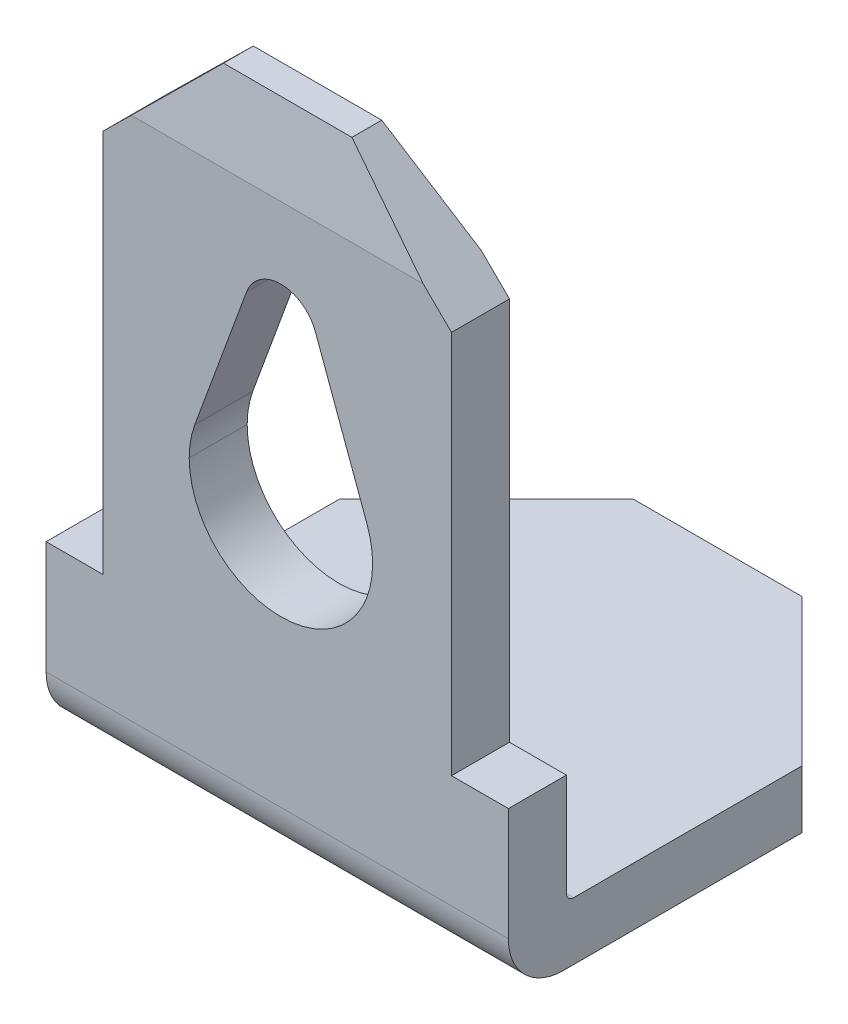
ISO-10303-21;
HEADER;
FILE_DESCRIPTION(('STEP AP214'),'2;1');
FILE_NAME('part.step','',(''),(''),'','','');
FILE_SCHEMA(('AUTOMOTIVE_DESIGN { 1 0 10303 214 1 1 1 1 }'));
ENDSEC;
DATA;
#1=APPLICATION_CONTEXT('core data for automotive mechanical design processes');
#2=APPLICATION_PROTOCOL_DEFINITION('international standard','automotive_design',2000,#1);
#3=PRODUCT_CONTEXT('',#1,'mechanical');
#4=PRODUCT('Part','Part','',(#3));
#5=PRODUCT_RELATED_PRODUCT_CATEGORY('part','',(#4));
#6=PRODUCT_DEFINITION_FORMATION('','',#4);
#7=PRODUCT_DEFINITION_CONTEXT('part definition',#1,'design');
#8=PRODUCT_DEFINITION('design','',#6,#7);
#9=PRODUCT_DEFINITION_SHAPE('','',#8);
#10=(LENGTH_UNIT() NAMED_UNIT(*) SI_UNIT(.MILLI.,.METRE.));
#11=(NAMED_UNIT(*) PLANE_ANGLE_UNIT() SI_UNIT($,.RADIAN.));
#12=(NAMED_UNIT(*) SI_UNIT($,.STERADIAN.) SOLID_ANGLE_UNIT());
#13=UNCERTAINTY_MEASURE_WITH_UNIT(LENGTH_MEASURE(1.E-05),#10,'distance_accuracy_value','');
#14=(GEOMETRIC_REPRESENTATION_CONTEXT(3) GLOBAL_UNCERTAINTY_ASSIGNED_CONTEXT((#13)) GLOBAL_UNIT_ASSIGNED_CONTEXT((#10,
#11,#12)) REPRESENTATION_CONTEXT('',''));
#15=CARTESIAN_POINT('',(0.,0.,0.));
#16=DIRECTION('',(0.,0.,1.));
#17=DIRECTION('',(1.,0.,0.));
#18=AXIS2_PLACEMENT_3D('',#15,#16,#17);
#19=CARTESIAN_POINT('',(0.755504439032288,6.71,-5.21));
#20=DIRECTION('',(0.702526659225822,-0.711657426770076,0.));
#21=DIRECTION('',(0.,0.,-1.));
#22=AXIS2_PLACEMENT_3D('',#19,#20,#21);
#23=PLANE('',#22);
#24=DIRECTION('',(0.,0.,1.));
#25=VECTOR('',#24,1.);
#26=CARTESIAN_POINT('',(2.275,8.21,-5.21));
#27=LINE('',#26,#25);
#28=CARTESIAN_POINT('',(2.275,8.21,0.241393442622949));
#29=VERTEX_POINT('',#28);
#30=CARTESIAN_POINT('',(2.275,8.21,0.647131147540979));
#31=VERTEX_POINT('',#30);
#32=EDGE_CURVE('E347',#29,#31,#27,.T.);
#33=ORIENTED_EDGE('',*,*,#32,.F.);
#34=DIRECTION('',(0.703347952461325,0.69432379783991,0.152368374414198));
#35=VECTOR('',#34,1.);
#36=CARTESIAN_POINT('',(3.70310483513415,9.61978184321707,0.550768072151586));
#37=LINE('',#36,#35);
#38=CARTESIAN_POINT('',(1.16070325529034,7.11,0.));
#39=VERTEX_POINT('',#38);
#40=EDGE_CURVE('E313',#39,#29,#37,.T.);
#41=ORIENTED_EDGE('',*,*,#40,.F.);
#42=DIRECTION('',(0.711657426770076,0.702526659225822,0.));
#43=VECTOR('',#42,1.);
#44=CARTESIAN_POINT('',(0.258824648699115,6.21969275288618,0.));
#45=LINE('',#44,#43);
#46=CARTESIAN_POINT('',(0.775,6.729245427366,0.));
#47=VERTEX_POINT('',#46);
#48=EDGE_CURVE('E289',#47,#39,#45,.T.);
#49=ORIENTED_EDGE('',*,*,#48,.F.);
#50=DIRECTION('',(0.,0.,-1.));
#51=VECTOR('',#50,1.);
#52=CARTESIAN_POINT('',(0.775,6.729245427366,7.54786240313508));
#53=LINE('',#52,#51);
#54=CARTESIAN_POINT('',(0.775,6.729245427366,0.79));
#55=VERTEX_POINT('',#54);
#56=EDGE_CURVE('E1116',#55,#47,#53,.T.);
#57=ORIENTED_EDGE('',*,*,#56,.F.);
#58=DIRECTION('',(0.711657426770076,0.702526659225822,0.));
#59=VECTOR('',#58,1.);
#60=CARTESIAN_POINT('',(0.755504439032288,6.71,0.79));
#61=LINE('',#60,#59);
#62=CARTESIAN_POINT('',(1.16070325529034,7.11,0.79));
#63=VERTEX_POINT('',#62);
#64=EDGE_CURVE('E407',#55,#63,#61,.T.);
#65=ORIENTED_EDGE('',*,*,#64,.T.);
#66=DIRECTION('',(-0.708713311399784,-0.699620317694541,0.0908672290418487));
#67=VECTOR('',#66,1.);
#68=CARTESIAN_POINT('',(4.29665509496487,10.2057166841054,0.387925918003297));
#69=LINE('',#68,#67);
#70=EDGE_CURVE('E370',#31,#63,#69,.T.);
#71=ORIENTED_EDGE('',*,*,#70,.F.);
#72=EDGE_LOOP('',(#33,#41,#49,#57,#65,#71));
#73=FACE_BOUND('',#72,.T.);
#74=ADVANCED_FACE('F16',(#73),#23,.F.);
#75=CARTESIAN_POINT('',(5.54449556096771,6.71,-5.21));
#76=DIRECTION('',(-0.702526659225822,-0.711657426770076,0.));
#77=DIRECTION('',(-0.711657426770076,0.702526659225822,0.));
#78=AXIS2_PLACEMENT_3D('',#75,#76,#77);
#79=PLANE('',#78);
#80=DIRECTION('',(0.711657426770076,-0.702526659225822,0.));
#81=VECTOR('',#80,1.);
#82=CARTESIAN_POINT('',(5.54449556096771,6.71,0.79));
#83=LINE('',#82,#81);
#84=CARTESIAN_POINT('',(5.13929674470966,7.11,0.79));
#85=VERTEX_POINT('',#84);
#86=CARTESIAN_POINT('',(5.525,6.729245427366,0.79));
#87=VERTEX_POINT('',#86);
#88=EDGE_CURVE('E403',#85,#87,#83,.T.);
#89=ORIENTED_EDGE('',*,*,#88,.T.);
#90=DIRECTION('',(0.,0.,1.));
#91=VECTOR('',#90,1.);
#92=CARTESIAN_POINT('',(5.525,6.729245427366,7.54786240313508));
#93=LINE('',#92,#91);
#94=CARTESIAN_POINT('',(5.525,6.729245427366,0.));
#95=VERTEX_POINT('',#94);
#96=EDGE_CURVE('E27',#95,#87,#93,.T.);
#97=ORIENTED_EDGE('',*,*,#96,.F.);
#98=DIRECTION('',(0.711657426770076,-0.702526659225822,0.));
#99=VECTOR('',#98,1.);
#100=CARTESIAN_POINT('',(9.23184999768602,3.06995537127141,0.));
#101=LINE('',#100,#99);
#102=CARTESIAN_POINT('',(5.13929674470966,7.11,0.));
#103=VERTEX_POINT('',#102);
#104=EDGE_CURVE('E302',#103,#95,#101,.T.);
#105=ORIENTED_EDGE('',*,*,#104,.F.);
#106=DIRECTION('',(0.703347952461325,-0.69432379783991,-0.152368374414198));
#107=VECTOR('',#106,1.);
#108=CARTESIAN_POINT('',(5.71349472092454,6.54316914741508,-0.124390228082159));
#109=LINE('',#108,#107);
#110=CARTESIAN_POINT('',(4.025,8.21,0.241393442622949));
#111=VERTEX_POINT('',#110);
#112=EDGE_CURVE('E328',#111,#103,#109,.T.);
#113=ORIENTED_EDGE('',*,*,#112,.F.);
#114=DIRECTION('',(0.,0.,1.));
#115=VECTOR('',#114,1.);
#116=CARTESIAN_POINT('',(4.025,8.21,-5.21));
#117=LINE('',#116,#115);
#118=CARTESIAN_POINT('',(4.025,8.21,0.647131147540979));
#119=VERTEX_POINT('',#118);
#120=EDGE_CURVE('E312',#111,#119,#117,.T.);
#121=ORIENTED_EDGE('',*,*,#120,.T.);
#122=DIRECTION('',(-0.708713311399784,0.699620317694541,-0.0908672290418487));
#123=VECTOR('',#122,1.);
#124=CARTESIAN_POINT('',(5.16767461889319,7.0819862220274,0.793638451192715));
#125=LINE('',#124,#123);
#126=EDGE_CURVE('E367',#85,#119,#125,.T.);
#127=ORIENTED_EDGE('',*,*,#126,.F.);
#128=EDGE_LOOP('',(#89,#97,#105,#113,#121,#127));
#129=FACE_BOUND('',#128,.T.);
#130=ADVANCED_FACE('F691',(#129),#79,.F.);
#131=CARTESIAN_POINT('',(6.3,1.49672365683442,7.54786240313508));
#132=DIRECTION('',(0.,-1.,0.));
#133=DIRECTION('',(0.,0.,-1.));
#134=AXIS2_PLACEMENT_3D('',#131,#132,#133);
#135=PLANE('',#134);
#136=DIRECTION('',(1.,0.,0.));
#137=VECTOR('',#136,1.);
#138=CARTESIAN_POINT('',(6.3,1.49672365683442,0.79));
#139=LINE('',#138,#137);
#140=CARTESIAN_POINT('',(5.525,1.49672365683442,0.79));
#141=VERTEX_POINT('',#140);
#142=CARTESIAN_POINT('',(6.3,1.49672365683442,0.79));
#143=VERTEX_POINT('',#142);
#144=EDGE_CURVE('E272',#141,#143,#139,.T.);
#145=ORIENTED_EDGE('',*,*,#144,.T.);
#146=DIRECTION('',(0.,0.,-1.));
#147=VECTOR('',#146,1.);
#148=CARTESIAN_POINT('',(6.3,1.49672365683442,7.54786240313508));
#149=LINE('',#148,#147);
#150=CARTESIAN_POINT('',(6.3,1.49672365683442,0.));
#151=VERTEX_POINT('',#150);
#152=EDGE_CURVE('E288',#143,#151,#149,.T.);
#153=ORIENTED_EDGE('',*,*,#152,.T.);
#154=DIRECTION('',(-1.,0.,0.));
#155=VECTOR('',#154,1.);
#156=CARTESIAN_POINT('',(6.3,1.49672365683442,0.));
#157=LINE('',#156,#155);
#158=CARTESIAN_POINT('',(5.525,1.49672365683442,0.));
#159=VERTEX_POINT('',#158);
#160=EDGE_CURVE('E458',#151,#159,#157,.T.);
#161=ORIENTED_EDGE('',*,*,#160,.T.);
#162=DIRECTION('',(0.,0.,-1.));
#163=VECTOR('',#162,1.);
#164=CARTESIAN_POINT('',(5.525,1.49672365683442,7.54786240313508));
#165=LINE('',#164,#163);
#166=EDGE_CURVE('E11',#141,#159,#165,.T.);
#167=ORIENTED_EDGE('',*,*,#166,.F.);
#168=EDGE_LOOP('',(#145,#153,#161,#167));
#169=FACE_BOUND('',#168,.T.);
#170=ADVANCED_FACE('F767',(#169),#135,.F.);
#171=CARTESIAN_POINT('',(5.525,1.49672365683442,7.54786240313508));
#172=DIRECTION('',(-1.,0.,0.));
#173=DIRECTION('',(0.,0.,1.));
#174=AXIS2_PLACEMENT_3D('',#171,#172,#173);
#175=PLANE('',#174);
#176=DIRECTION('',(0.,1.,0.));
#177=VECTOR('',#176,1.);
#178=CARTESIAN_POINT('',(5.525,1.49672365683442,0.));
#179=LINE('',#178,#177);
#180=EDGE_CURVE('E444',#159,#95,#179,.T.);
#181=ORIENTED_EDGE('',*,*,#180,.T.);
#182=ORIENTED_EDGE('',*,*,#96,.T.);
#183=DIRECTION('',(0.,-1.,0.));
#184=VECTOR('',#183,1.);
#185=CARTESIAN_POINT('',(5.525,1.49672365683442,0.79));
#186=LINE('',#185,#184);
#187=EDGE_CURVE('E408',#87,#141,#186,.T.);
#188=ORIENTED_EDGE('',*,*,#187,.T.);
#189=ORIENTED_EDGE('',*,*,#166,.T.);
#190=EDGE_LOOP('',(#181,#182,#188,#189));
#191=FACE_BOUND('',#190,.T.);
#192=ADVANCED_FACE('F794',(#191),#175,.F.);
#193=CARTESIAN_POINT('',(0.,1.49672365683442,7.54786240313508));
#194=DIRECTION('',(0.,-1.,0.));
#195=DIRECTION('',(0.,0.,-1.));
#196=AXIS2_PLACEMENT_3D('',#193,#194,#195);
#197=PLANE('',#196);
#198=DIRECTION('',(1.,0.,0.));
#199=VECTOR('',#198,1.);
#200=CARTESIAN_POINT('',(0.,1.49672365683442,0.79));
#201=LINE('',#200,#199);
#202=CARTESIAN_POINT('',(0.,1.49672365683442,0.79));
#203=VERTEX_POINT('',#202);
#204=CARTESIAN_POINT('',(0.775,1.49672365683442,0.79));
#205=VERTEX_POINT('',#204);
#206=EDGE_CURVE('E303',#203,#205,#201,.T.);
#207=ORIENTED_EDGE('',*,*,#206,.T.);
#208=DIRECTION('',(0.,0.,-1.));
#209=VECTOR('',#208,1.);
#210=CARTESIAN_POINT('',(0.775,1.49672365683442,7.54786240313508));
#211=LINE('',#210,#209);
#212=CARTESIAN_POINT('',(0.775,1.49672365683442,0.));
#213=VERTEX_POINT('',#212);
#214=EDGE_CURVE('E119',#205,#213,#211,.T.);
#215=ORIENTED_EDGE('',*,*,#214,.T.);
#216=DIRECTION('',(-1.,0.,0.));
#217=VECTOR('',#216,1.);
#218=CARTESIAN_POINT('',(0.,1.49672365683442,0.));
#219=LINE('',#218,#217);
#220=CARTESIAN_POINT('',(0.,1.49672365683442,0.));
#221=VERTEX_POINT('',#220);
#222=EDGE_CURVE('E371',#213,#221,#219,.T.);
#223=ORIENTED_EDGE('',*,*,#222,.T.);
#224=DIRECTION('',(0.,0.,-1.));
#225=VECTOR('',#224,1.);
#226=CARTESIAN_POINT('',(0.,1.49672365683442,7.54786240313508));
#227=LINE('',#226,#225);
#228=EDGE_CURVE('E101',#203,#221,#227,.T.);
#229=ORIENTED_EDGE('',*,*,#228,.F.);
#230=EDGE_LOOP('',(#207,#215,#223,#229));
#231=FACE_BOUND('',#230,.T.);
#232=ADVANCED_FACE('F803',(#231),#197,.F.);
#233=CARTESIAN_POINT('',(0.775,1.49672365683442,7.54786240313508));
#234=DIRECTION('',(1.,0.,0.));
#235=DIRECTION('',(0.,1.,0.));
#236=AXIS2_PLACEMENT_3D('',#233,#234,#235);
#237=PLANE('',#236);
#238=DIRECTION('',(0.,1.,0.));
#239=VECTOR('',#238,1.);
#240=CARTESIAN_POINT('',(0.775,1.49672365683442,0.79));
#241=LINE('',#240,#239);
#242=EDGE_CURVE('E307',#205,#55,#241,.T.);
#243=ORIENTED_EDGE('',*,*,#242,.T.);
#244=ORIENTED_EDGE('',*,*,#56,.T.);
#245=DIRECTION('',(0.,-1.,0.));
#246=VECTOR('',#245,1.);
#247=CARTESIAN_POINT('',(0.775,1.49672365683442,0.));
#248=LINE('',#247,#246);
#249=EDGE_CURVE('E292',#47,#213,#248,.T.);
#250=ORIENTED_EDGE('',*,*,#249,.T.);
#251=ORIENTED_EDGE('',*,*,#214,.F.);
#252=EDGE_LOOP('',(#243,#244,#250,#251));
#253=FACE_BOUND('',#252,.T.);
#254=ADVANCED_FACE('F684',(#253),#237,.F.);
#255=CARTESIAN_POINT('',(2.73062224435422,5.80882986931079,-4.65485766531386));
#256=DIRECTION('',(-0.938755511291561,0.344583937553277,0.));
#257=DIRECTION('',(0.,0.,1.));
#258=AXIS2_PLACEMENT_3D('',#255,#256,#257);
#259=PLANE('',#258);
#260=DIRECTION('',(0.344583937553277,0.938755511291561,0.));
#261=VECTOR('',#260,1.);
#262=CARTESIAN_POINT('',(2.73062224435422,5.80882986931079,0.));
#263=LINE('',#262,#261);
#264=CARTESIAN_POINT('',(2.02655561088555,3.89072992194159,0.));
#265=VERTEX_POINT('',#264);
#266=CARTESIAN_POINT('',(2.73062224435422,5.80882986931079,0.));
#267=VERTEX_POINT('',#266);
#268=EDGE_CURVE('E254',#265,#267,#263,.T.);
#269=ORIENTED_EDGE('',*,*,#268,.T.);
#270=DIRECTION('',(0.,0.,1.));
#271=VECTOR('',#270,1.);
#272=CARTESIAN_POINT('',(2.73062224435422,5.80882986931079,-4.65485766531386));
#273=LINE('',#272,#271);
#274=CARTESIAN_POINT('',(2.73062224435422,5.80882986931079,0.79));
#275=VERTEX_POINT('',#274);
#276=EDGE_CURVE('E249',#267,#275,#273,.T.);
#277=ORIENTED_EDGE('',*,*,#276,.T.);
#278=DIRECTION('',(-0.344583937553277,-0.938755511291561,0.));
#279=VECTOR('',#278,1.);
#280=CARTESIAN_POINT('',(2.73062224435422,5.80882986931079,0.79));
#281=LINE('',#280,#279);
#282=CARTESIAN_POINT('',(2.02655561088555,3.89072992194159,0.79));
#283=VERTEX_POINT('',#282);
#284=EDGE_CURVE('E252',#275,#283,#281,.T.);
#285=ORIENTED_EDGE('',*,*,#284,.T.);
#286=DIRECTION('',(0.,0.,1.));
#287=VECTOR('',#286,1.);
#288=CARTESIAN_POINT('',(2.02655561088555,3.89072992194159,-4.65485766531386));
#289=LINE('',#288,#287);
#290=EDGE_CURVE('E42',#265,#283,#289,.T.);
#291=ORIENTED_EDGE('',*,*,#290,.F.);
#292=EDGE_LOOP('',(#269,#277,#285,#291));
#293=FACE_BOUND('',#292,.T.);
#294=ADVANCED_FACE('F18',(#293),#259,.F.);
#295=CARTESIAN_POINT('',(3.2,3.46,-4.65485766531386));
#296=DIRECTION('',(0.,0.,1.));
#297=DIRECTION('',(1.,0.,0.));
#298=AXIS2_PLACEMENT_3D('',#295,#296,#297);
#299=CYLINDRICAL_SURFACE('',#298,1.25);
#300=DIRECTION('',(0.,0.,1.));
#301=VECTOR('',#300,1.);
#302=CARTESIAN_POINT('',(1.95,3.46,-4.65485766531386));
#303=LINE('',#302,#301);
#304=CARTESIAN_POINT('',(1.95,3.46,0.));
#305=VERTEX_POINT('',#304);
#306=CARTESIAN_POINT('',(1.95,3.46,0.79));
#307=VERTEX_POINT('',#306);
#308=EDGE_CURVE('E338',#305,#307,#303,.T.);
#309=ORIENTED_EDGE('',*,*,#308,.F.);
#310=CARTESIAN_POINT('',(3.2,3.46,0.));
#311=DIRECTION('',(0.,0.,-1.));
#312=DIRECTION('',(0.,-1.,0.));
#313=AXIS2_PLACEMENT_3D('',#310,#311,#312);
#314=CIRCLE('',#313,1.25);
#315=EDGE_CURVE('E402',#305,#265,#314,.T.);
#316=ORIENTED_EDGE('',*,*,#315,.T.);
#317=ORIENTED_EDGE('',*,*,#290,.T.);
#318=CARTESIAN_POINT('',(3.2,3.46,0.79));
#319=DIRECTION('',(0.,0.,1.));
#320=DIRECTION('',(1.,0.,0.));
#321=AXIS2_PLACEMENT_3D('',#318,#319,#320);
#322=CIRCLE('',#321,1.25);
#323=EDGE_CURVE('E270',#283,#307,#322,.T.);
#324=ORIENTED_EDGE('',*,*,#323,.T.);
#325=EDGE_LOOP('',(#309,#316,#317,#324));
#326=FACE_BOUND('',#325,.T.);
#327=ADVANCED_FACE('F683',(#326),#299,.F.);
#328=CARTESIAN_POINT('',(3.66963395220552,5.8081302981974,-4.65485766531386));
#329=DIRECTION('',(0.938755417652649,0.344584192655147,0.));
#330=DIRECTION('',(0.,0.,-1.));
#331=AXIS2_PLACEMENT_3D('',#328,#329,#330);
#332=PLANE('',#331);
#333=DIRECTION('',(0.344584192655148,-0.93875541765265,0.));
#334=VECTOR('',#333,1.);
#335=CARTESIAN_POINT('',(3.66963395220552,5.8081302981974,0.));
#336=LINE('',#335,#334);
#337=CARTESIAN_POINT('',(3.66963395220552,5.8081302981974,0.));
#338=VERTEX_POINT('',#337);
#339=CARTESIAN_POINT('',(4.37344427206581,3.89073024081894,0.));
#340=VERTEX_POINT('',#339);
#341=EDGE_CURVE('E157',#338,#340,#336,.T.);
#342=ORIENTED_EDGE('',*,*,#341,.T.);
#343=DIRECTION('',(0.,0.,1.));
#344=VECTOR('',#343,1.);
#345=CARTESIAN_POINT('',(4.37344427206581,3.89073024081894,-4.65485766531386));
#346=LINE('',#345,#344);
#347=CARTESIAN_POINT('',(4.37344427206581,3.89073024081894,0.79));
#348=VERTEX_POINT('',#347);
#349=EDGE_CURVE('E333',#340,#348,#346,.T.);
#350=ORIENTED_EDGE('',*,*,#349,.T.);
#351=DIRECTION('',(-0.344584192655148,0.93875541765265,0.));
#352=VECTOR('',#351,1.);
#353=CARTESIAN_POINT('',(3.66963395220552,5.8081302981974,0.79));
#354=LINE('',#353,#352);
#355=CARTESIAN_POINT('',(3.66963395220552,5.8081302981974,0.79));
#356=VERTEX_POINT('',#355);
#357=EDGE_CURVE('E265',#348,#356,#354,.T.);
#358=ORIENTED_EDGE('',*,*,#357,.T.);
#359=DIRECTION('',(0.,0.,1.));
#360=VECTOR('',#359,1.);
#361=CARTESIAN_POINT('',(3.66963395220552,5.8081302981974,-4.65485766531386));
#362=LINE('',#361,#360);
#363=EDGE_CURVE('E20',#338,#356,#362,.T.);
#364=ORIENTED_EDGE('',*,*,#363,.F.);
#365=EDGE_LOOP('',(#342,#350,#358,#364));
#366=FACE_BOUND('',#365,.T.);
#367=ADVANCED_FACE('F735',(#366),#332,.F.);
#368=CARTESIAN_POINT('',(3.2,5.63653790053415,-4.65485766531386));
#369=DIRECTION('',(0.,0.,1.));
#370=DIRECTION('',(1.,0.,0.));
#371=AXIS2_PLACEMENT_3D('',#368,#369,#370);
#372=CYLINDRICAL_SURFACE('',#371,0.5);
#373=CARTESIAN_POINT('',(3.2,5.63653790053415,0.));
#374=DIRECTION('',(0.,0.,-1.));
#375=DIRECTION('',(0.,-1.,0.));
#376=AXIS2_PLACEMENT_3D('',#373,#374,#375);
#377=CIRCLE('',#376,0.5);
#378=EDGE_CURVE('E354',#267,#338,#377,.T.);
#379=ORIENTED_EDGE('',*,*,#378,.T.);
#380=ORIENTED_EDGE('',*,*,#363,.T.);
#381=CARTESIAN_POINT('',(3.2,5.63653790053415,0.79));
#382=DIRECTION('',(0.,0.,1.));
#383=DIRECTION('',(1.,0.,0.));
#384=AXIS2_PLACEMENT_3D('',#381,#382,#383);
#385=CIRCLE('',#384,0.5);
#386=EDGE_CURVE('E261',#356,#275,#385,.T.);
#387=ORIENTED_EDGE('',*,*,#386,.T.);
#388=ORIENTED_EDGE('',*,*,#276,.F.);
#389=EDGE_LOOP('',(#379,#380,#387,#388));
#390=FACE_BOUND('',#389,.T.);
#391=ADVANCED_FACE('F262',(#390),#372,.F.);
#392=CARTESIAN_POINT('',(2.,-0.79,-5.21));
#393=DIRECTION('',(0.707106781186549,0.,0.707106781186546));
#394=DIRECTION('',(0.,-1.,0.));
#395=AXIS2_PLACEMENT_3D('',#392,#393,#394);
#396=PLANE('',#395);
#397=DIRECTION('',(0.707106781186546,0.,-0.707106781186549));
#398=VECTOR('',#397,1.);
#399=CARTESIAN_POINT('',(2.,-0.79,-5.21));
#400=LINE('',#399,#398);
#401=CARTESIAN_POINT('',(0.,-0.79,-3.21));
#402=VERTEX_POINT('',#401);
#403=CARTESIAN_POINT('',(2.,-0.79,-5.21));
#404=VERTEX_POINT('',#403);
#405=EDGE_CURVE('E388',#402,#404,#400,.T.);
#406=ORIENTED_EDGE('',*,*,#405,.F.);
#407=DIRECTION('',(0.,-1.,0.));
#408=VECTOR('',#407,1.);
#409=CARTESIAN_POINT('',(0.,-0.0400000000000007,-3.21));
#410=LINE('',#409,#408);
#411=CARTESIAN_POINT('',(0.,0.,-3.21));
#412=VERTEX_POINT('',#411);
#413=EDGE_CURVE('E497',#412,#402,#410,.T.);
#414=ORIENTED_EDGE('',*,*,#413,.F.);
#415=DIRECTION('',(-0.707106781186546,0.,0.707106781186549));
#416=VECTOR('',#415,1.);
#417=CARTESIAN_POINT('',(2.,0.,-5.21));
#418=LINE('',#417,#416);
#419=CARTESIAN_POINT('',(2.,0.,-5.21));
#420=VERTEX_POINT('',#419);
#421=EDGE_CURVE('E357',#420,#412,#418,.T.);
#422=ORIENTED_EDGE('',*,*,#421,.F.);
#423=DIRECTION('',(0.,1.,0.));
#424=VECTOR('',#423,1.);
#425=CARTESIAN_POINT('',(2.,-0.79,-5.21));
#426=LINE('',#425,#424);
#427=EDGE_CURVE('E314',#404,#420,#426,.T.);
#428=ORIENTED_EDGE('',*,*,#427,.F.);
#429=EDGE_LOOP('',(#406,#414,#422,#428));
#430=FACE_BOUND('',#429,.T.);
#431=ADVANCED_FACE('F487',(#430),#396,.F.);
#432=CARTESIAN_POINT('',(6.3,-0.0400000000000007,-3.21));
#433=DIRECTION('',(0.707106781186546,0.,-0.707106781186549));
#434=DIRECTION('',(0.,-1.,0.));
#435=AXIS2_PLACEMENT_3D('',#432,#433,#434);
#436=PLANE('',#435);
#437=DIRECTION('',(0.707106781186549,0.,0.707106781186546));
#438=VECTOR('',#437,1.);
#439=CARTESIAN_POINT('',(6.3,-0.79,-3.21));
#440=LINE('',#439,#438);
#441=CARTESIAN_POINT('',(4.3,-0.79,-5.21));
#442=VERTEX_POINT('',#441);
#443=CARTESIAN_POINT('',(6.3,-0.79,-3.21));
#444=VERTEX_POINT('',#443);
#445=EDGE_CURVE('E378',#442,#444,#440,.T.);
#446=ORIENTED_EDGE('',*,*,#445,.F.);
#447=DIRECTION('',(0.,-1.,0.));
#448=VECTOR('',#447,1.);
#449=CARTESIAN_POINT('',(4.3,-0.79,-5.21));
#450=LINE('',#449,#448);
#451=CARTESIAN_POINT('',(4.3,0.,-5.21));
#452=VERTEX_POINT('',#451);
#453=EDGE_CURVE('E319',#452,#442,#450,.T.);
#454=ORIENTED_EDGE('',*,*,#453,.F.);
#455=DIRECTION('',(-0.707106781186549,0.,-0.707106781186546));
#456=VECTOR('',#455,1.);
#457=CARTESIAN_POINT('',(6.3,0.,-3.21));
#458=LINE('',#457,#456);
#459=CARTESIAN_POINT('',(6.3,0.,-3.21));
#460=VERTEX_POINT('',#459);
#461=EDGE_CURVE('E361',#460,#452,#458,.T.);
#462=ORIENTED_EDGE('',*,*,#461,.F.);
#463=DIRECTION('',(0.,1.,0.));
#464=VECTOR('',#463,1.);
#465=CARTESIAN_POINT('',(6.3,0.,-3.21));
#466=LINE('',#465,#464);
#467=EDGE_CURVE('E285',#444,#460,#466,.T.);
#468=ORIENTED_EDGE('',*,*,#467,.F.);
#469=EDGE_LOOP('',(#446,#454,#462,#468));
#470=FACE_BOUND('',#469,.T.);
#471=ADVANCED_FACE('F699',(#470),#436,.T.);
#472=CARTESIAN_POINT('',(0.,-0.0400000000000007,0.0399999999999991));
#473=DIRECTION('',(1.,0.,0.));
#474=DIRECTION('',(0.,1.,0.));
#475=AXIS2_PLACEMENT_3D('',#472,#473,#474);
#476=PLANE('',#475);
#477=DIRECTION('',(0.,-1.,0.));
#478=VECTOR('',#477,1.);
#479=CARTESIAN_POINT('',(0.,7.11,0.79));
#480=LINE('',#479,#478);
#481=CARTESIAN_POINT('',(0.,-0.0400000000000005,0.79));
#482=VERTEX_POINT('',#481);
#483=EDGE_CURVE('E306',#203,#482,#480,.T.);
#484=ORIENTED_EDGE('',*,*,#483,.F.);
#485=ORIENTED_EDGE('',*,*,#228,.T.);
#486=DIRECTION('',(0.,1.,0.));
#487=VECTOR('',#486,1.);
#488=CARTESIAN_POINT('',(0.,0.1,0.));
#489=LINE('',#488,#487);
#490=CARTESIAN_POINT('',(0.,0.1,0.));
#491=VERTEX_POINT('',#490);
#492=EDGE_CURVE('E374',#491,#221,#489,.T.);
#493=ORIENTED_EDGE('',*,*,#492,.F.);
#494=CARTESIAN_POINT('',(0.,0.1,-0.1));
#495=DIRECTION('',(-1.,0.,0.));
#496=DIRECTION('',(0.,0.,-1.));
#497=AXIS2_PLACEMENT_3D('',#494,#495,#496);
#498=CIRCLE('',#497,0.1);
#499=CARTESIAN_POINT('',(0.,0.,-0.1));
#500=VERTEX_POINT('',#499);
#501=EDGE_CURVE('E298',#500,#491,#498,.T.);
#502=ORIENTED_EDGE('',*,*,#501,.F.);
#503=DIRECTION('',(0.,0.,1.));
#504=VECTOR('',#503,1.);
#505=CARTESIAN_POINT('',(0.,0.,-5.21));
#506=LINE('',#505,#504);
#507=EDGE_CURVE('E283',#412,#500,#506,.T.);
#508=ORIENTED_EDGE('',*,*,#507,.F.);
#509=ORIENTED_EDGE('',*,*,#413,.T.);
#510=DIRECTION('',(0.,0.,-1.));
#511=VECTOR('',#510,1.);
#512=CARTESIAN_POINT('',(0.,-0.79,0.0399999999999991));
#513=LINE('',#512,#511);
#514=CARTESIAN_POINT('',(0.,-0.79,0.0399999999999991));
#515=VERTEX_POINT('',#514);
#516=EDGE_CURVE('E384',#515,#402,#513,.T.);
#517=ORIENTED_EDGE('',*,*,#516,.F.);
#518=CARTESIAN_POINT('',(0.,-0.0400000000000007,0.0399999999999991));
#519=DIRECTION('',(1.,0.,0.));
#520=DIRECTION('',(0.,0.,-1.));
#521=AXIS2_PLACEMENT_3D('',#518,#519,#520);
#522=CIRCLE('',#521,0.75);
#523=EDGE_CURVE('E432',#482,#515,#522,.T.);
#524=ORIENTED_EDGE('',*,*,#523,.F.);
#525=EDGE_LOOP('',(#484,#485,#493,#502,#508,#509,#517,#524));
#526=FACE_BOUND('',#525,.T.);
#527=ADVANCED_FACE('F495',(#526),#476,.F.);
#528=CARTESIAN_POINT('',(6.3,-0.0400000000000007,0.0399999999999991));
#529=DIRECTION('',(1.,0.,0.));
#530=DIRECTION('',(0.,1.,0.));
#531=AXIS2_PLACEMENT_3D('',#528,#529,#530);
#532=PLANE('',#531);
#533=ORIENTED_EDGE('',*,*,#152,.F.);
#534=DIRECTION('',(0.,-1.,0.));
#535=VECTOR('',#534,1.);
#536=CARTESIAN_POINT('',(6.3,7.11,0.79));
#537=LINE('',#536,#535);
#538=CARTESIAN_POINT('',(6.3,-0.0400000000000005,0.79));
#539=VERTEX_POINT('',#538);
#540=EDGE_CURVE('E279',#143,#539,#537,.T.);
#541=ORIENTED_EDGE('',*,*,#540,.T.);
#542=CARTESIAN_POINT('',(6.3,-0.0400000000000007,0.0399999999999991));
#543=DIRECTION('',(1.,0.,0.));
#544=DIRECTION('',(0.,0.,-1.));
#545=AXIS2_PLACEMENT_3D('',#542,#543,#544);
#546=CIRCLE('',#545,0.75);
#547=CARTESIAN_POINT('',(6.3,-0.79,0.0399999999999991));
#548=VERTEX_POINT('',#547);
#549=EDGE_CURVE('E416',#539,#548,#546,.T.);
#550=ORIENTED_EDGE('',*,*,#549,.T.);
#551=DIRECTION('',(0.,0.,-1.));
#552=VECTOR('',#551,1.);
#553=CARTESIAN_POINT('',(6.3,-0.79,0.0399999999999991));
#554=LINE('',#553,#552);
#555=EDGE_CURVE('E382',#548,#444,#554,.T.);
#556=ORIENTED_EDGE('',*,*,#555,.T.);
#557=ORIENTED_EDGE('',*,*,#467,.T.);
#558=DIRECTION('',(0.,0.,1.));
#559=VECTOR('',#558,1.);
#560=CARTESIAN_POINT('',(6.3,0.,-5.21));
#561=LINE('',#560,#559);
#562=CARTESIAN_POINT('',(6.3,0.,-0.1));
#563=VERTEX_POINT('',#562);
#564=EDGE_CURVE('E318',#460,#563,#561,.T.);
#565=ORIENTED_EDGE('',*,*,#564,.T.);
#566=CARTESIAN_POINT('',(6.3,0.1,-0.1));
#567=DIRECTION('',(-1.,0.,0.));
#568=DIRECTION('',(0.,0.,-1.));
#569=AXIS2_PLACEMENT_3D('',#566,#567,#568);
#570=CIRCLE('',#569,0.1);
#571=CARTESIAN_POINT('',(6.3,0.1,0.));
#572=VERTEX_POINT('',#571);
#573=EDGE_CURVE('E297',#563,#572,#570,.T.);
#574=ORIENTED_EDGE('',*,*,#573,.T.);
#575=DIRECTION('',(0.,1.,0.));
#576=VECTOR('',#575,1.);
#577=CARTESIAN_POINT('',(6.3,0.1,0.));
#578=LINE('',#577,#576);
#579=EDGE_CURVE('E1119',#572,#151,#578,.T.);
#580=ORIENTED_EDGE('',*,*,#579,.T.);
#581=EDGE_LOOP('',(#533,#541,#550,#556,#557,#565,#574,#580));
#582=FACE_BOUND('',#581,.T.);
#583=ADVANCED_FACE('F811',(#582),#532,.T.);
#584=CARTESIAN_POINT('',(6.3,0.1,0.));
#585=DIRECTION('',(0.,0.,1.));
#586=DIRECTION('',(0.,-1.,0.));
#587=AXIS2_PLACEMENT_3D('',#584,#585,#586);
#588=PLANE('',#587);
#589=ORIENTED_EDGE('',*,*,#341,.F.);
#590=ORIENTED_EDGE('',*,*,#378,.F.);
#591=ORIENTED_EDGE('',*,*,#268,.F.);
#592=ORIENTED_EDGE('',*,*,#315,.F.);
#593=CARTESIAN_POINT('',(3.2,3.46,0.));
#594=DIRECTION('',(0.,0.,-1.));
#595=DIRECTION('',(0.,-1.,0.));
#596=AXIS2_PLACEMENT_3D('',#593,#594,#595);
#597=CIRCLE('',#596,1.25);
#598=CARTESIAN_POINT('',(4.45,3.46,0.));
#599=VERTEX_POINT('',#598);
#600=EDGE_CURVE('E334',#599,#305,#597,.T.);
#601=ORIENTED_EDGE('',*,*,#600,.F.);
#602=CARTESIAN_POINT('',(3.2,3.46,0.));
#603=DIRECTION('',(0.,0.,-1.));
#604=DIRECTION('',(0.,-1.,0.));
#605=AXIS2_PLACEMENT_3D('',#602,#603,#604);
#606=CIRCLE('',#605,1.25);
#607=EDGE_CURVE('E345',#340,#599,#606,.T.);
#608=ORIENTED_EDGE('',*,*,#607,.F.);
#609=EDGE_LOOP('',(#589,#590,#591,#592,#601,#608));
#610=FACE_BOUND('',#609,.T.);
#611=DIRECTION('',(-1.,0.,0.));
#612=VECTOR('',#611,1.);
#613=CARTESIAN_POINT('',(6.3,7.11,0.));
#614=LINE('',#613,#612);
#615=EDGE_CURVE('E324',#103,#39,#614,.T.);
#616=ORIENTED_EDGE('',*,*,#615,.F.);
#617=ORIENTED_EDGE('',*,*,#104,.T.);
#618=ORIENTED_EDGE('',*,*,#180,.F.);
#619=ORIENTED_EDGE('',*,*,#160,.F.);
#620=ORIENTED_EDGE('',*,*,#579,.F.);
#621=DIRECTION('',(-1.,0.,0.));
#622=VECTOR('',#621,1.);
#623=CARTESIAN_POINT('',(6.3,0.1,0.));
#624=LINE('',#623,#622);
#625=EDGE_CURVE('E293',#572,#491,#624,.T.);
#626=ORIENTED_EDGE('',*,*,#625,.T.);
#627=ORIENTED_EDGE('',*,*,#492,.T.);
#628=ORIENTED_EDGE('',*,*,#222,.F.);
#629=ORIENTED_EDGE('',*,*,#249,.F.);
#630=ORIENTED_EDGE('',*,*,#48,.T.);
#631=EDGE_LOOP('',(#616,#617,#618,#619,#620,#626,#627,#628,#629,#630));
#632=FACE_BOUND('',#631,.T.);
#633=ADVANCED_FACE('F776',(#610,#632),#588,.F.);
#634=CARTESIAN_POINT('',(6.3,0.1,-0.1));
#635=DIRECTION('',(-1.,0.,0.));
#636=DIRECTION('',(0.,0.,1.));
#637=AXIS2_PLACEMENT_3D('',#634,#635,#636);
#638=CYLINDRICAL_SURFACE('',#637,0.1);
#639=ORIENTED_EDGE('',*,*,#501,.T.);
#640=ORIENTED_EDGE('',*,*,#625,.F.);
#641=ORIENTED_EDGE('',*,*,#573,.F.);
#642=DIRECTION('',(-1.,0.,0.));
#643=VECTOR('',#642,1.);
#644=CARTESIAN_POINT('',(6.3,0.,-0.1));
#645=LINE('',#644,#643);
#646=EDGE_CURVE('E323',#563,#500,#645,.T.);
#647=ORIENTED_EDGE('',*,*,#646,.T.);
#648=EDGE_LOOP('',(#639,#640,#641,#647));
#649=FACE_BOUND('',#648,.T.);
#650=ADVANCED_FACE('F759',(#649),#638,.F.);
#651=CARTESIAN_POINT('',(6.3,0.,-5.21));
#652=DIRECTION('',(0.,-1.,0.));
#653=DIRECTION('',(0.,0.,-1.));
#654=AXIS2_PLACEMENT_3D('',#651,#652,#653);
#655=PLANE('',#654);
#656=ORIENTED_EDGE('',*,*,#564,.F.);
#657=ORIENTED_EDGE('',*,*,#461,.T.);
#658=DIRECTION('',(-1.,0.,0.));
#659=VECTOR('',#658,1.);
#660=CARTESIAN_POINT('',(6.3,0.,-5.21));
#661=LINE('',#660,#659);
#662=EDGE_CURVE('E341',#452,#420,#661,.T.);
#663=ORIENTED_EDGE('',*,*,#662,.T.);
#664=ORIENTED_EDGE('',*,*,#421,.T.);
#665=ORIENTED_EDGE('',*,*,#507,.T.);
#666=ORIENTED_EDGE('',*,*,#646,.F.);
#667=EDGE_LOOP('',(#656,#657,#663,#664,#665,#666));
#668=FACE_BOUND('',#667,.T.);
#669=ADVANCED_FACE('F477',(#668),#655,.F.);
#670=CARTESIAN_POINT('',(6.3,-0.79,-5.21));
#671=DIRECTION('',(0.,0.,1.));
#672=DIRECTION('',(1.,0.,0.));
#673=AXIS2_PLACEMENT_3D('',#670,#671,#672);
#674=PLANE('',#673);
#675=ORIENTED_EDGE('',*,*,#662,.F.);
#676=ORIENTED_EDGE('',*,*,#453,.T.);
#677=DIRECTION('',(-1.,0.,0.));
#678=VECTOR('',#677,1.);
#679=CARTESIAN_POINT('',(6.3,-0.79,-5.21));
#680=LINE('',#679,#678);
#681=EDGE_CURVE('E383',#442,#404,#680,.T.);
#682=ORIENTED_EDGE('',*,*,#681,.T.);
#683=ORIENTED_EDGE('',*,*,#427,.T.);
#684=EDGE_LOOP('',(#675,#676,#682,#683));
#685=FACE_BOUND('',#684,.T.);
#686=ADVANCED_FACE('F482',(#685),#674,.F.);
#687=CARTESIAN_POINT('',(6.3,-0.79,0.0399999999999991));
#688=DIRECTION('',(0.,1.,0.));
#689=DIRECTION('',(1.,0.,0.));
#690=AXIS2_PLACEMENT_3D('',#687,#688,#689);
#691=PLANE('',#690);
#692=ORIENTED_EDGE('',*,*,#681,.F.);
#693=ORIENTED_EDGE('',*,*,#445,.T.);
#694=ORIENTED_EDGE('',*,*,#555,.F.);
#695=DIRECTION('',(-1.,0.,0.));
#696=VECTOR('',#695,1.);
#697=CARTESIAN_POINT('',(6.3,-0.79,0.0399999999999991));
#698=LINE('',#697,#696);
#699=EDGE_CURVE('E448',#548,#515,#698,.T.);
#700=ORIENTED_EDGE('',*,*,#699,.T.);
#701=ORIENTED_EDGE('',*,*,#516,.T.);
#702=ORIENTED_EDGE('',*,*,#405,.T.);
#703=EDGE_LOOP('',(#692,#693,#694,#700,#701,#702));
#704=FACE_BOUND('',#703,.T.);
#705=ADVANCED_FACE('F489',(#704),#691,.F.);
#706=CARTESIAN_POINT('',(6.3,-0.0400000000000007,0.0399999999999991));
#707=DIRECTION('',(-1.,0.,0.));
#708=DIRECTION('',(0.,0.,1.));
#709=AXIS2_PLACEMENT_3D('',#706,#707,#708);
#710=CYLINDRICAL_SURFACE('',#709,0.75);
#711=ORIENTED_EDGE('',*,*,#523,.T.);
#712=ORIENTED_EDGE('',*,*,#699,.F.);
#713=ORIENTED_EDGE('',*,*,#549,.F.);
#714=DIRECTION('',(-1.,0.,0.));
#715=VECTOR('',#714,1.);
#716=CARTESIAN_POINT('',(6.3,-0.0400000000000005,0.79));
#717=LINE('',#716,#715);
#718=EDGE_CURVE('E409',#539,#482,#717,.T.);
#719=ORIENTED_EDGE('',*,*,#718,.T.);
#720=EDGE_LOOP('',(#711,#712,#713,#719));
#721=FACE_BOUND('',#720,.T.);
#722=ADVANCED_FACE('F782',(#721),#710,.T.);
#723=CARTESIAN_POINT('',(6.3,7.11,0.79));
#724=DIRECTION('',(0.,0.,-1.));
#725=DIRECTION('',(-1.,0.,0.));
#726=AXIS2_PLACEMENT_3D('',#723,#724,#725);
#727=PLANE('',#726);
#728=ORIENTED_EDGE('',*,*,#284,.F.);
#729=ORIENTED_EDGE('',*,*,#386,.F.);
#730=ORIENTED_EDGE('',*,*,#357,.F.);
#731=CARTESIAN_POINT('',(3.2,3.46,0.79));
#732=DIRECTION('',(0.,0.,1.));
#733=DIRECTION('',(1.,0.,0.));
#734=AXIS2_PLACEMENT_3D('',#731,#732,#733);
#735=CIRCLE('',#734,1.25);
#736=CARTESIAN_POINT('',(4.45,3.46,0.79));
#737=VERTEX_POINT('',#736);
#738=EDGE_CURVE('E172',#737,#348,#735,.T.);
#739=ORIENTED_EDGE('',*,*,#738,.F.);
#740=CARTESIAN_POINT('',(3.2,3.46,0.79));
#741=DIRECTION('',(0.,0.,1.));
#742=DIRECTION('',(1.,0.,0.));
#743=AXIS2_PLACEMENT_3D('',#740,#741,#742);
#744=CIRCLE('',#743,1.25);
#745=EDGE_CURVE('E346',#307,#737,#744,.T.);
#746=ORIENTED_EDGE('',*,*,#745,.F.);
#747=ORIENTED_EDGE('',*,*,#323,.F.);
#748=EDGE_LOOP('',(#728,#729,#730,#739,#746,#747));
#749=FACE_BOUND('',#748,.T.);
#750=ORIENTED_EDGE('',*,*,#187,.F.);
#751=ORIENTED_EDGE('',*,*,#88,.F.);
#752=DIRECTION('',(-1.,0.,0.));
#753=VECTOR('',#752,1.);
#754=CARTESIAN_POINT('',(6.3,7.11,0.79));
#755=LINE('',#754,#753);
#756=EDGE_CURVE('E350',#85,#63,#755,.T.);
#757=ORIENTED_EDGE('',*,*,#756,.T.);
#758=ORIENTED_EDGE('',*,*,#64,.F.);
#759=ORIENTED_EDGE('',*,*,#242,.F.);
#760=ORIENTED_EDGE('',*,*,#206,.F.);
#761=ORIENTED_EDGE('',*,*,#483,.T.);
#762=ORIENTED_EDGE('',*,*,#718,.F.);
#763=ORIENTED_EDGE('',*,*,#540,.F.);
#764=ORIENTED_EDGE('',*,*,#144,.F.);
#765=EDGE_LOOP('',(#750,#751,#757,#758,#759,#760,#761,#762,#763,#764));
#766=FACE_BOUND('',#765,.T.);
#767=ADVANCED_FACE('F268',(#749,#766),#727,.F.);
#768=CARTESIAN_POINT('',(6.3,8.21,0.64713114754098));
#769=DIRECTION('',(0.,-0.128798962302804,-0.991670725245896));
#770=DIRECTION('',(0.,-0.991670725245896,0.128798962302804));
#771=AXIS2_PLACEMENT_3D('',#768,#769,#770);
#772=PLANE('',#771);
#773=ORIENTED_EDGE('',*,*,#756,.F.);
#774=ORIENTED_EDGE('',*,*,#126,.T.);
#775=DIRECTION('',(-1.,0.,0.));
#776=VECTOR('',#775,1.);
#777=CARTESIAN_POINT('',(6.3,8.21,0.64713114754098));
#778=LINE('',#777,#776);
#779=EDGE_CURVE('E308',#119,#31,#778,.T.);
#780=ORIENTED_EDGE('',*,*,#779,.T.);
#781=ORIENTED_EDGE('',*,*,#70,.T.);
#782=EDGE_LOOP('',(#773,#774,#780,#781));
#783=FACE_BOUND('',#782,.T.);
#784=ADVANCED_FACE('F719',(#783),#772,.F.);
#785=CARTESIAN_POINT('',(6.3,8.21,0.241393442622951));
#786=DIRECTION('',(0.,-1.,0.));
#787=DIRECTION('',(0.,0.,-1.));
#788=AXIS2_PLACEMENT_3D('',#785,#786,#787);
#789=PLANE('',#788);
#790=ORIENTED_EDGE('',*,*,#779,.F.);
#791=ORIENTED_EDGE('',*,*,#120,.F.);
#792=DIRECTION('',(-1.,0.,0.));
#793=VECTOR('',#792,1.);
#794=CARTESIAN_POINT('',(6.3,8.21,0.241393442622951));
#795=LINE('',#794,#793);
#796=EDGE_CURVE('E329',#111,#29,#795,.T.);
#797=ORIENTED_EDGE('',*,*,#796,.T.);
#798=ORIENTED_EDGE('',*,*,#32,.T.);
#799=EDGE_LOOP('',(#790,#791,#797,#798));
#800=FACE_BOUND('',#799,.T.);
#801=ADVANCED_FACE('F714',(#800),#789,.F.);
#802=CARTESIAN_POINT('',(6.3,7.11,0.));
#803=DIRECTION('',(0.,-0.214348018272917,0.976757353216485));
#804=DIRECTION('',(-1.,0.,0.));
#805=AXIS2_PLACEMENT_3D('',#802,#803,#804);
#806=PLANE('',#805);
#807=ORIENTED_EDGE('',*,*,#796,.F.);
#808=ORIENTED_EDGE('',*,*,#112,.T.);
#809=ORIENTED_EDGE('',*,*,#615,.T.);
#810=ORIENTED_EDGE('',*,*,#40,.T.);
#811=EDGE_LOOP('',(#807,#808,#809,#810));
#812=FACE_BOUND('',#811,.T.);
#813=ADVANCED_FACE('F718',(#812),#806,.F.);
#814=CARTESIAN_POINT('',(3.2,3.46,-4.65485766531386));
#815=DIRECTION('',(0.,0.,1.));
#816=DIRECTION('',(1.,0.,0.));
#817=AXIS2_PLACEMENT_3D('',#814,#815,#816);
#818=CYLINDRICAL_SURFACE('',#817,1.25);
#819=ORIENTED_EDGE('',*,*,#607,.T.);
#820=DIRECTION('',(0.,0.,1.));
#821=VECTOR('',#820,1.);
#822=CARTESIAN_POINT('',(4.45,3.46,-4.65485766531386));
#823=LINE('',#822,#821);
#824=EDGE_CURVE('E342',#599,#737,#823,.T.);
#825=ORIENTED_EDGE('',*,*,#824,.T.);
#826=ORIENTED_EDGE('',*,*,#738,.T.);
#827=ORIENTED_EDGE('',*,*,#349,.F.);
#828=EDGE_LOOP('',(#819,#825,#826,#827));
#829=FACE_BOUND('',#828,.T.);
#830=ADVANCED_FACE('F708',(#829),#818,.F.);
#831=CARTESIAN_POINT('',(3.2,3.46,-4.65485766531386));
#832=DIRECTION('',(0.,0.,1.));
#833=DIRECTION('',(1.,0.,0.));
#834=AXIS2_PLACEMENT_3D('',#831,#832,#833);
#835=CYLINDRICAL_SURFACE('',#834,1.25);
#836=ORIENTED_EDGE('',*,*,#600,.T.);
#837=ORIENTED_EDGE('',*,*,#308,.T.);
#838=ORIENTED_EDGE('',*,*,#745,.T.);
#839=ORIENTED_EDGE('',*,*,#824,.F.);
#840=EDGE_LOOP('',(#836,#837,#838,#839));
#841=FACE_BOUND('',#840,.T.);
#842=ADVANCED_FACE('F704',(#841),#835,.F.);
#843=CLOSED_SHELL('',(#74,#130,#170,#192,#232,#254,#294,#327,#367,#391,#431,#471,#527,#583,#633,
#650,#669,#686,#705,#722,#767,#784,#801,#813,#830,#842));
#844=MANIFOLD_SOLID_BREP('B1',#843);
#845=ADVANCED_BREP_SHAPE_REPRESENTATION('',(#18,#844),#14);
#846=SHAPE_DEFINITION_REPRESENTATION(#9,#845);
ENDSEC;
END-ISO-10303-21;
